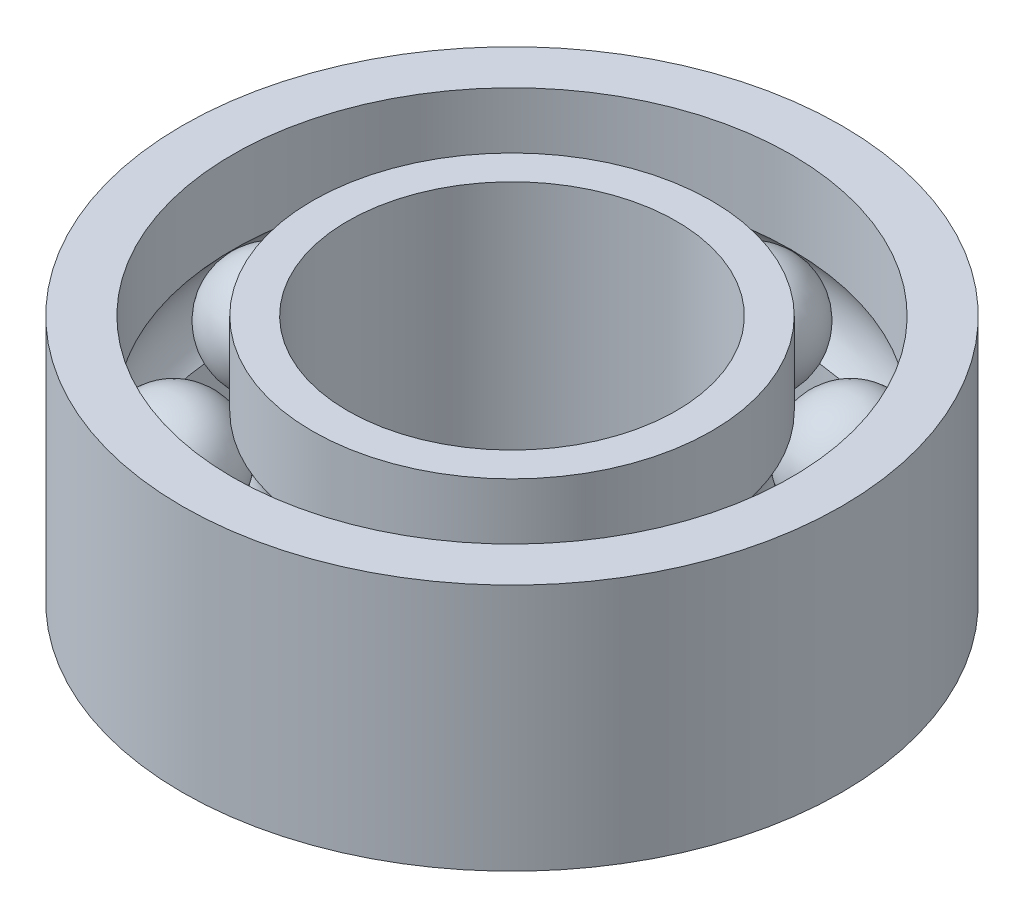
ISO-10303-21;
HEADER;
FILE_DESCRIPTION(('STEP AP214'),'2;1');
FILE_NAME('part.step','',(''),(''),'','','');
FILE_SCHEMA(('AUTOMOTIVE_DESIGN { 1 0 10303 214 1 1 1 1 }'));
ENDSEC;
DATA;
#1=APPLICATION_CONTEXT('core data for automotive mechanical design processes');
#2=APPLICATION_PROTOCOL_DEFINITION('international standard','automotive_design',2000,#1);
#3=PRODUCT_CONTEXT('',#1,'mechanical');
#4=PRODUCT('Part','Part','',(#3));
#5=PRODUCT_RELATED_PRODUCT_CATEGORY('part','',(#4));
#6=PRODUCT_DEFINITION_FORMATION('','',#4);
#7=PRODUCT_DEFINITION_CONTEXT('part definition',#1,'design');
#8=PRODUCT_DEFINITION('design','',#6,#7);
#9=PRODUCT_DEFINITION_SHAPE('','',#8);
#10=(LENGTH_UNIT() NAMED_UNIT(*) SI_UNIT(.MILLI.,.METRE.));
#11=(NAMED_UNIT(*) PLANE_ANGLE_UNIT() SI_UNIT($,.RADIAN.));
#12=(NAMED_UNIT(*) SI_UNIT($,.STERADIAN.) SOLID_ANGLE_UNIT());
#13=UNCERTAINTY_MEASURE_WITH_UNIT(LENGTH_MEASURE(1.E-05),#10,'distance_accuracy_value','');
#14=(GEOMETRIC_REPRESENTATION_CONTEXT(3) GLOBAL_UNCERTAINTY_ASSIGNED_CONTEXT((#13)) GLOBAL_UNIT_ASSIGNED_CONTEXT((#10,
#11,#12)) REPRESENTATION_CONTEXT('',''));
#15=CARTESIAN_POINT('',(0.,0.,0.));
#16=DIRECTION('',(0.,0.,1.));
#17=DIRECTION('',(1.,0.,0.));
#18=AXIS2_PLACEMENT_3D('',#15,#16,#17);
#19=CARTESIAN_POINT('',(-3.26683332908189,2.39,3.26683332908181));
#20=DIRECTION('',(0.,1.,0.));
#21=DIRECTION('',(0.707106781186556,0.,-0.707106781186539));
#22=AXIS2_PLACEMENT_3D('',#19,#20,#21);
#23=SPHERICAL_SURFACE('',#22,1.1);
#24=CARTESIAN_POINT('',(-3.26683332908189,3.49,3.26683332908181));
#25=VERTEX_POINT('',#24);
#26=VERTEX_LOOP('',#25);
#27=FACE_BOUND('',#26,.T.);
#28=ADVANCED_FACE('F40',(#27),#23,.T.);
#29=CLOSED_SHELL('',(#28));
#30=MANIFOLD_SOLID_BREP('B2',#29);
#31=CARTESIAN_POINT('',(0.,2.39,4.62));
#32=DIRECTION('',(0.,1.,0.));
#33=DIRECTION('',(0.,0.,-1.));
#34=AXIS2_PLACEMENT_3D('',#31,#32,#33);
#35=SPHERICAL_SURFACE('',#34,1.1);
#36=CARTESIAN_POINT('',(0.,3.49,4.62));
#37=VERTEX_POINT('',#36);
#38=VERTEX_LOOP('',#37);
#39=FACE_BOUND('',#38,.T.);
#40=ADVANCED_FACE('F59',(#39),#35,.T.);
#41=CLOSED_SHELL('',(#40));
#42=MANIFOLD_SOLID_BREP('B6',#41);
#43=CARTESIAN_POINT('',(3.26683332908182,2.39,3.26683332908188));
#44=DIRECTION('',(0.,1.,0.));
#45=DIRECTION('',(-0.707106781186541,0.,-0.707106781186554));
#46=AXIS2_PLACEMENT_3D('',#43,#44,#45);
#47=SPHERICAL_SURFACE('',#46,1.1);
#48=CARTESIAN_POINT('',(3.26683332908182,3.49,3.26683332908188));
#49=VERTEX_POINT('',#48);
#50=VERTEX_LOOP('',#49);
#51=FACE_BOUND('',#50,.T.);
#52=ADVANCED_FACE('F78',(#51),#47,.T.);
#53=CLOSED_SHELL('',(#52));
#54=MANIFOLD_SOLID_BREP('B36',#53);
#55=CARTESIAN_POINT('',(4.62,2.39,0.));
#56=DIRECTION('',(0.,1.,0.));
#57=DIRECTION('',(-1.,0.,0.));
#58=AXIS2_PLACEMENT_3D('',#55,#56,#57);
#59=SPHERICAL_SURFACE('',#58,1.1);
#60=CARTESIAN_POINT('',(4.62,3.49,0.));
#61=VERTEX_POINT('',#60);
#62=VERTEX_LOOP('',#61);
#63=FACE_BOUND('',#62,.T.);
#64=ADVANCED_FACE('F97',(#63),#59,.T.);
#65=CLOSED_SHELL('',(#64));
#66=MANIFOLD_SOLID_BREP('B55',#65);
#67=CARTESIAN_POINT('',(3.26683332908187,2.39,-3.26683332908183));
#68=DIRECTION('',(0.,1.,0.));
#69=DIRECTION('',(-0.707106781186551,0.,0.707106781186544));
#70=AXIS2_PLACEMENT_3D('',#67,#68,#69);
#71=SPHERICAL_SURFACE('',#70,1.1);
#72=CARTESIAN_POINT('',(3.26683332908187,3.49,-3.26683332908183));
#73=VERTEX_POINT('',#72);
#74=VERTEX_LOOP('',#73);
#75=FACE_BOUND('',#74,.T.);
#76=ADVANCED_FACE('F116',(#75),#71,.T.);
#77=CLOSED_SHELL('',(#76));
#78=MANIFOLD_SOLID_BREP('B74',#77);
#79=CARTESIAN_POINT('',(0.,2.39,-4.62));
#80=DIRECTION('',(0.,1.,0.));
#81=DIRECTION('',(0.,0.,1.));
#82=AXIS2_PLACEMENT_3D('',#79,#80,#81);
#83=SPHERICAL_SURFACE('',#82,1.1);
#84=CARTESIAN_POINT('',(0.,3.49,-4.62));
#85=VERTEX_POINT('',#84);
#86=VERTEX_LOOP('',#85);
#87=FACE_BOUND('',#86,.T.);
#88=ADVANCED_FACE('F135',(#87),#83,.T.);
#89=CLOSED_SHELL('',(#88));
#90=MANIFOLD_SOLID_BREP('B93',#89);
#91=CARTESIAN_POINT('',(-3.26683332908184,2.39,-3.26683332908186));
#92=DIRECTION('',(0.,1.,0.));
#93=DIRECTION('',(0.707106781186546,0.,0.707106781186549));
#94=AXIS2_PLACEMENT_3D('',#91,#92,#93);
#95=SPHERICAL_SURFACE('',#94,1.1);
#96=CARTESIAN_POINT('',(-3.26683332908184,3.49,-3.26683332908186));
#97=VERTEX_POINT('',#96);
#98=VERTEX_LOOP('',#97);
#99=FACE_BOUND('',#98,.T.);
#100=ADVANCED_FACE('F154',(#99),#95,.T.);
#101=CLOSED_SHELL('',(#100));
#102=MANIFOLD_SOLID_BREP('B112',#101);
#103=CARTESIAN_POINT('',(-4.62,2.39,0.));
#104=DIRECTION('',(0.,1.,0.));
#105=DIRECTION('',(1.,0.,0.));
#106=AXIS2_PLACEMENT_3D('',#103,#104,#105);
#107=SPHERICAL_SURFACE('',#106,1.1);
#108=CARTESIAN_POINT('',(-4.62,3.49,0.));
#109=VERTEX_POINT('',#108);
#110=VERTEX_LOOP('',#109);
#111=FACE_BOUND('',#110,.T.);
#112=ADVANCED_FACE('F175',(#111),#107,.T.);
#113=CLOSED_SHELL('',(#112));
#114=MANIFOLD_SOLID_BREP('B131',#113);
#115=CARTESIAN_POINT('',(0.,4.78,0.));
#116=DIRECTION('',(0.,-1.,0.));
#117=DIRECTION('',(0.,0.,-1.));
#118=AXIS2_PLACEMENT_3D('',#115,#116,#117);
#119=CYLINDRICAL_SURFACE('',#118,3.85);
#120=CARTESIAN_POINT('',(0.,3.18949984365227,0.));
#121=DIRECTION('',(0.,-1.,0.));
#122=DIRECTION('',(0.,0.,-1.));
#123=AXIS2_PLACEMENT_3D('',#120,#121,#122);
#124=CIRCLE('',#123,3.85);
#125=CARTESIAN_POINT('',(0.,3.18949984365227,-3.85));
#126=VERTEX_POINT('',#125);
#127=EDGE_CURVE('E199',#126,#126,#124,.F.);
#128=ORIENTED_EDGE('',*,*,#127,.T.);
#129=EDGE_LOOP('',(#128));
#130=FACE_BOUND('',#129,.T.);
#131=CARTESIAN_POINT('',(0.,4.78,0.));
#132=DIRECTION('',(0.,1.,0.));
#133=DIRECTION('',(0.,0.,1.));
#134=AXIS2_PLACEMENT_3D('',#131,#132,#133);
#135=CIRCLE('',#134,3.85);
#136=CARTESIAN_POINT('',(0.,4.78,3.85));
#137=VERTEX_POINT('',#136);
#138=EDGE_CURVE('E174',#137,#137,#135,.T.);
#139=ORIENTED_EDGE('',*,*,#138,.F.);
#140=EDGE_LOOP('',(#139));
#141=FACE_BOUND('',#140,.T.);
#142=ADVANCED_FACE('F195',(#130,#141),#119,.T.);
#143=CARTESIAN_POINT('',(0.,4.78,0.));
#144=DIRECTION('',(0.,1.,0.));
#145=DIRECTION('',(0.,0.,1.));
#146=AXIS2_PLACEMENT_3D('',#143,#144,#145);
#147=PLANE('',#146);
#148=ORIENTED_EDGE('',*,*,#138,.T.);
#149=EDGE_LOOP('',(#148));
#150=FACE_BOUND('',#149,.T.);
#151=CARTESIAN_POINT('',(0.,4.78,0.));
#152=DIRECTION('',(0.,1.,0.));
#153=DIRECTION('',(0.,0.,1.));
#154=AXIS2_PLACEMENT_3D('',#151,#152,#153);
#155=CIRCLE('',#154,3.17);
#156=CARTESIAN_POINT('',(0.,4.78,3.17));
#157=VERTEX_POINT('',#156);
#158=EDGE_CURVE('E208',#157,#157,#155,.T.);
#159=ORIENTED_EDGE('',*,*,#158,.F.);
#160=EDGE_LOOP('',(#159));
#161=FACE_BOUND('',#160,.T.);
#162=ADVANCED_FACE('F229',(#150,#161),#147,.T.);
#163=CARTESIAN_POINT('',(0.,0.,0.));
#164=DIRECTION('',(0.,1.,0.));
#165=DIRECTION('',(0.,0.,1.));
#166=AXIS2_PLACEMENT_3D('',#163,#164,#165);
#167=PLANE('',#166);
#168=CARTESIAN_POINT('',(0.,0.,0.));
#169=DIRECTION('',(0.,1.,0.));
#170=DIRECTION('',(0.,0.,1.));
#171=AXIS2_PLACEMENT_3D('',#168,#169,#170);
#172=CIRCLE('',#171,3.85);
#173=CARTESIAN_POINT('',(0.,0.,3.85));
#174=VERTEX_POINT('',#173);
#175=EDGE_CURVE('E203',#174,#174,#172,.T.);
#176=ORIENTED_EDGE('',*,*,#175,.F.);
#177=EDGE_LOOP('',(#176));
#178=FACE_BOUND('',#177,.T.);
#179=CARTESIAN_POINT('',(0.,0.,0.));
#180=DIRECTION('',(0.,1.,0.));
#181=DIRECTION('',(0.,0.,1.));
#182=AXIS2_PLACEMENT_3D('',#179,#180,#181);
#183=CIRCLE('',#182,3.17);
#184=CARTESIAN_POINT('',(0.,0.,3.17));
#185=VERTEX_POINT('',#184);
#186=EDGE_CURVE('E211',#185,#185,#183,.T.);
#187=ORIENTED_EDGE('',*,*,#186,.T.);
#188=EDGE_LOOP('',(#187));
#189=FACE_BOUND('',#188,.T.);
#190=ADVANCED_FACE('F231',(#178,#189),#167,.F.);
#191=CARTESIAN_POINT('',(0.,1.59050015634773,0.));
#192=DIRECTION('',(0.,1.,0.));
#193=DIRECTION('',(0.,0.,1.));
#194=AXIS2_PLACEMENT_3D('',#191,#192,#193);
#195=CIRCLE('',#194,3.85);
#196=CARTESIAN_POINT('',(0.,1.59050015634773,3.85));
#197=VERTEX_POINT('',#196);
#198=EDGE_CURVE('E213',#197,#197,#195,.F.);
#199=ORIENTED_EDGE('',*,*,#198,.T.);
#200=EDGE_LOOP('',(#199));
#201=FACE_BOUND('',#200,.T.);
#202=ORIENTED_EDGE('',*,*,#175,.T.);
#203=EDGE_LOOP('',(#202));
#204=FACE_BOUND('',#203,.T.);
#205=ADVANCED_FACE('F197',(#201,#204),#119,.T.);
#206=CARTESIAN_POINT('',(0.,4.78,0.));
#207=DIRECTION('',(0.,-1.,0.));
#208=DIRECTION('',(0.,0.,-1.));
#209=AXIS2_PLACEMENT_3D('',#206,#207,#208);
#210=CYLINDRICAL_SURFACE('',#209,3.17);
#211=ORIENTED_EDGE('',*,*,#158,.T.);
#212=EDGE_LOOP('',(#211));
#213=FACE_BOUND('',#212,.T.);
#214=ORIENTED_EDGE('',*,*,#186,.F.);
#215=EDGE_LOOP('',(#214));
#216=FACE_BOUND('',#215,.T.);
#217=ADVANCED_FACE('F226',(#213,#216),#210,.F.);
#218=CARTESIAN_POINT('',(0.,2.39,0.));
#219=DIRECTION('',(0.,1.,0.));
#220=DIRECTION('',(0.,0.,1.));
#221=AXIS2_PLACEMENT_3D('',#218,#219,#220);
#222=TOROIDAL_SURFACE('',#221,4.62,1.11);
#223=ORIENTED_EDGE('',*,*,#198,.F.);
#224=EDGE_LOOP('',(#223));
#225=FACE_BOUND('',#224,.T.);
#226=ORIENTED_EDGE('',*,*,#127,.F.);
#227=EDGE_LOOP('',(#226));
#228=FACE_BOUND('',#227,.T.);
#229=ADVANCED_FACE('F241',(#225,#228),#222,.F.);
#230=CLOSED_SHELL('',(#142,#162,#190,#205,#217,#229));
#231=MANIFOLD_SOLID_BREP('B150',#230);
#232=CARTESIAN_POINT('',(0.,4.78,0.));
#233=DIRECTION('',(0.,-1.,0.));
#234=DIRECTION('',(0.,0.,-1.));
#235=AXIS2_PLACEMENT_3D('',#232,#233,#234);
#236=CYLINDRICAL_SURFACE('',#235,5.39);
#237=CARTESIAN_POINT('',(0.,3.18949984365227,0.));
#238=DIRECTION('',(0.,-1.,0.));
#239=DIRECTION('',(0.,0.,-1.));
#240=AXIS2_PLACEMENT_3D('',#237,#238,#239);
#241=CIRCLE('',#240,5.39);
#242=CARTESIAN_POINT('',(0.,3.18949984365227,-5.39));
#243=VERTEX_POINT('',#242);
#244=EDGE_CURVE('E290',#243,#243,#241,.F.);
#245=ORIENTED_EDGE('',*,*,#244,.F.);
#246=EDGE_LOOP('',(#245));
#247=FACE_BOUND('',#246,.T.);
#248=CARTESIAN_POINT('',(0.,4.78,0.));
#249=DIRECTION('',(0.,1.,0.));
#250=DIRECTION('',(0.,0.,1.));
#251=AXIS2_PLACEMENT_3D('',#248,#249,#250);
#252=CIRCLE('',#251,5.39);
#253=CARTESIAN_POINT('',(0.,4.78,5.39));
#254=VERTEX_POINT('',#253);
#255=EDGE_CURVE('E299',#254,#254,#252,.T.);
#256=ORIENTED_EDGE('',*,*,#255,.T.);
#257=EDGE_LOOP('',(#256));
#258=FACE_BOUND('',#257,.T.);
#259=ADVANCED_FACE('F286',(#247,#258),#236,.F.);
#260=CARTESIAN_POINT('',(0.,4.78,0.));
#261=DIRECTION('',(0.,1.,0.));
#262=DIRECTION('',(0.,0.,1.));
#263=AXIS2_PLACEMENT_3D('',#260,#261,#262);
#264=PLANE('',#263);
#265=CARTESIAN_POINT('',(0.,4.78,0.));
#266=DIRECTION('',(0.,1.,0.));
#267=DIRECTION('',(0.,0.,1.));
#268=AXIS2_PLACEMENT_3D('',#265,#266,#267);
#269=CIRCLE('',#268,6.36);
#270=CARTESIAN_POINT('',(0.,4.78,6.36));
#271=VERTEX_POINT('',#270);
#272=EDGE_CURVE('E194',#271,#271,#269,.T.);
#273=ORIENTED_EDGE('',*,*,#272,.T.);
#274=EDGE_LOOP('',(#273));
#275=FACE_BOUND('',#274,.T.);
#276=ORIENTED_EDGE('',*,*,#255,.F.);
#277=EDGE_LOOP('',(#276));
#278=FACE_BOUND('',#277,.T.);
#279=ADVANCED_FACE('F318',(#275,#278),#264,.T.);
#280=CARTESIAN_POINT('',(0.,0.,0.));
#281=DIRECTION('',(0.,1.,0.));
#282=DIRECTION('',(0.,0.,1.));
#283=AXIS2_PLACEMENT_3D('',#280,#281,#282);
#284=PLANE('',#283);
#285=CARTESIAN_POINT('',(0.,0.,0.));
#286=DIRECTION('',(0.,1.,0.));
#287=DIRECTION('',(0.,0.,1.));
#288=AXIS2_PLACEMENT_3D('',#285,#286,#287);
#289=CIRCLE('',#288,6.36);
#290=CARTESIAN_POINT('',(0.,0.,6.36));
#291=VERTEX_POINT('',#290);
#292=EDGE_CURVE('E294',#291,#291,#289,.T.);
#293=ORIENTED_EDGE('',*,*,#292,.F.);
#294=EDGE_LOOP('',(#293));
#295=FACE_BOUND('',#294,.T.);
#296=CARTESIAN_POINT('',(0.,0.,0.));
#297=DIRECTION('',(0.,1.,0.));
#298=DIRECTION('',(0.,0.,1.));
#299=AXIS2_PLACEMENT_3D('',#296,#297,#298);
#300=CIRCLE('',#299,5.39);
#301=CARTESIAN_POINT('',(0.,0.,5.39));
#302=VERTEX_POINT('',#301);
#303=EDGE_CURVE('E302',#302,#302,#300,.T.);
#304=ORIENTED_EDGE('',*,*,#303,.T.);
#305=EDGE_LOOP('',(#304));
#306=FACE_BOUND('',#305,.T.);
#307=ADVANCED_FACE('F320',(#295,#306),#284,.F.);
#308=CARTESIAN_POINT('',(0.,4.78,0.));
#309=DIRECTION('',(0.,-1.,0.));
#310=DIRECTION('',(0.,0.,-1.));
#311=AXIS2_PLACEMENT_3D('',#308,#309,#310);
#312=CYLINDRICAL_SURFACE('',#311,6.36);
#313=ORIENTED_EDGE('',*,*,#272,.F.);
#314=EDGE_LOOP('',(#313));
#315=FACE_BOUND('',#314,.T.);
#316=ORIENTED_EDGE('',*,*,#292,.T.);
#317=EDGE_LOOP('',(#316));
#318=FACE_BOUND('',#317,.T.);
#319=ADVANCED_FACE('F288',(#315,#318),#312,.T.);
#320=CARTESIAN_POINT('',(0.,1.59050015634773,0.));
#321=DIRECTION('',(0.,1.,0.));
#322=DIRECTION('',(0.,0.,1.));
#323=AXIS2_PLACEMENT_3D('',#320,#321,#322);
#324=CIRCLE('',#323,5.39);
#325=CARTESIAN_POINT('',(0.,1.59050015634773,5.39));
#326=VERTEX_POINT('',#325);
#327=EDGE_CURVE('E304',#326,#326,#324,.F.);
#328=ORIENTED_EDGE('',*,*,#327,.F.);
#329=EDGE_LOOP('',(#328));
#330=FACE_BOUND('',#329,.T.);
#331=ORIENTED_EDGE('',*,*,#303,.F.);
#332=EDGE_LOOP('',(#331));
#333=FACE_BOUND('',#332,.T.);
#334=ADVANCED_FACE('F329',(#330,#333),#236,.F.);
#335=CARTESIAN_POINT('',(0.,2.39,0.));
#336=DIRECTION('',(0.,1.,0.));
#337=DIRECTION('',(0.,0.,1.));
#338=AXIS2_PLACEMENT_3D('',#335,#336,#337);
#339=TOROIDAL_SURFACE('',#338,4.62,1.11);
#340=ORIENTED_EDGE('',*,*,#244,.T.);
#341=EDGE_LOOP('',(#340));
#342=FACE_BOUND('',#341,.T.);
#343=ORIENTED_EDGE('',*,*,#327,.T.);
#344=EDGE_LOOP('',(#343));
#345=FACE_BOUND('',#344,.T.);
#346=ADVANCED_FACE('F332',(#342,#345),#339,.F.);
#347=CLOSED_SHELL('',(#259,#279,#307,#319,#334,#346));
#348=MANIFOLD_SOLID_BREP('B169',#347);
#349=ADVANCED_BREP_SHAPE_REPRESENTATION('',(#18,#30,#42,#54,#66,#78,#90,#102,#114,#231,#348),#14);
#350=SHAPE_DEFINITION_REPRESENTATION(#9,#349);
ENDSEC;
END-ISO-10303-21;
